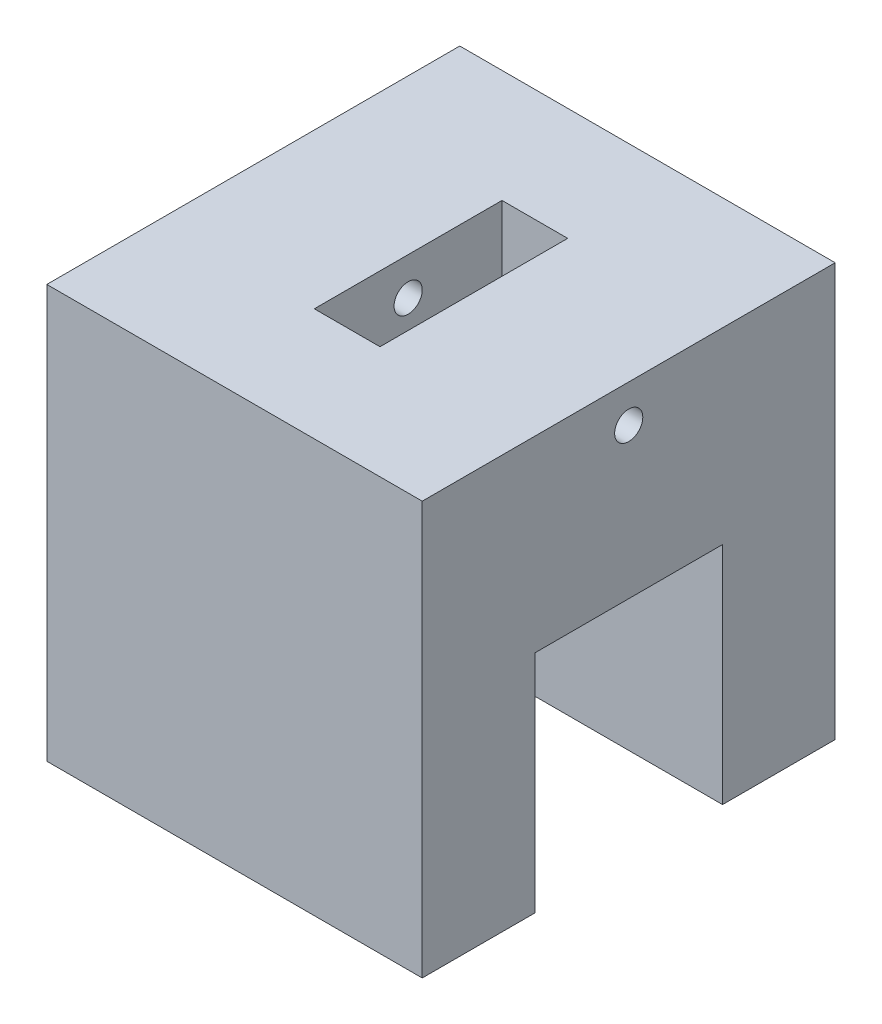
ISO-10303-21;
HEADER;
FILE_DESCRIPTION(('STEP AP214'),'2;1');
FILE_NAME('part.step','',(''),(''),'','','');
FILE_SCHEMA(('AUTOMOTIVE_DESIGN { 1 0 10303 214 1 1 1 1 }'));
ENDSEC;
DATA;
#1=APPLICATION_CONTEXT('core data for automotive mechanical design processes');
#2=APPLICATION_PROTOCOL_DEFINITION('international standard','automotive_design',2000,#1);
#3=PRODUCT_CONTEXT('',#1,'mechanical');
#4=PRODUCT('Part','Part','',(#3));
#5=PRODUCT_RELATED_PRODUCT_CATEGORY('part','',(#4));
#6=PRODUCT_DEFINITION_FORMATION('','',#4);
#7=PRODUCT_DEFINITION_CONTEXT('part definition',#1,'design');
#8=PRODUCT_DEFINITION('design','',#6,#7);
#9=PRODUCT_DEFINITION_SHAPE('','',#8);
#10=(LENGTH_UNIT() NAMED_UNIT(*) SI_UNIT(.MILLI.,.METRE.));
#11=(NAMED_UNIT(*) PLANE_ANGLE_UNIT() SI_UNIT($,.RADIAN.));
#12=(NAMED_UNIT(*) SI_UNIT($,.STERADIAN.) SOLID_ANGLE_UNIT());
#13=UNCERTAINTY_MEASURE_WITH_UNIT(LENGTH_MEASURE(1.E-05),#10,'distance_accuracy_value','');
#14=(GEOMETRIC_REPRESENTATION_CONTEXT(3) GLOBAL_UNCERTAINTY_ASSIGNED_CONTEXT((#13)) GLOBAL_UNIT_ASSIGNED_CONTEXT((#10,
#11,#12)) REPRESENTATION_CONTEXT('',''));
#15=CARTESIAN_POINT('',(0.,0.,0.));
#16=DIRECTION('',(0.,0.,1.));
#17=DIRECTION('',(1.,0.,0.));
#18=AXIS2_PLACEMENT_3D('',#15,#16,#17);
#19=CARTESIAN_POINT('',(-100.,80.,0.));
#20=DIRECTION('',(1.,0.,0.));
#21=DIRECTION('',(0.,0.,-1.));
#22=AXIS2_PLACEMENT_3D('',#19,#20,#21);
#23=CYLINDRICAL_SURFACE('',#22,7.50000000000001);
#24=CARTESIAN_POINT('',(-17.5,80.,0.));
#25=DIRECTION('',(-1.,0.,0.));
#26=DIRECTION('',(0.,0.,1.));
#27=AXIS2_PLACEMENT_3D('',#24,#25,#26);
#28=CIRCLE('',#27,7.50000000000001);
#29=CARTESIAN_POINT('',(-17.5,80.,7.49999999999998));
#30=VERTEX_POINT('',#29);
#31=EDGE_CURVE('E43',#30,#30,#28,.F.);
#32=ORIENTED_EDGE('',*,*,#31,.T.);
#33=EDGE_LOOP('',(#32));
#34=FACE_BOUND('',#33,.T.);
#35=CARTESIAN_POINT('',(-100.,80.,0.));
#36=DIRECTION('',(1.,0.,0.));
#37=DIRECTION('',(0.,0.,-1.));
#38=AXIS2_PLACEMENT_3D('',#35,#36,#37);
#39=CIRCLE('',#38,7.50000000000001);
#40=CARTESIAN_POINT('',(-100.,80.,-7.50000000000003));
#41=VERTEX_POINT('',#40);
#42=EDGE_CURVE('E222',#41,#41,#39,.T.);
#43=ORIENTED_EDGE('',*,*,#42,.F.);
#44=EDGE_LOOP('',(#43));
#45=FACE_BOUND('',#44,.T.);
#46=ADVANCED_FACE('F39',(#34,#45),#23,.F.);
#47=CARTESIAN_POINT('',(-100.,100.,110.));
#48=DIRECTION('',(0.,0.,1.));
#49=DIRECTION('',(0.,-1.,0.));
#50=AXIS2_PLACEMENT_3D('',#47,#48,#49);
#51=PLANE('',#50);
#52=DIRECTION('',(1.,0.,0.));
#53=VECTOR('',#52,1.);
#54=CARTESIAN_POINT('',(-100.,-120.,110.));
#55=LINE('',#54,#53);
#56=CARTESIAN_POINT('',(-100.,-120.,110.));
#57=VERTEX_POINT('',#56);
#58=CARTESIAN_POINT('',(100.,-120.,110.));
#59=VERTEX_POINT('',#58);
#60=EDGE_CURVE('E256',#57,#59,#55,.T.);
#61=ORIENTED_EDGE('',*,*,#60,.T.);
#62=DIRECTION('',(0.,-1.,0.));
#63=VECTOR('',#62,1.);
#64=CARTESIAN_POINT('',(100.,100.,110.));
#65=LINE('',#64,#63);
#66=CARTESIAN_POINT('',(100.,100.,110.));
#67=VERTEX_POINT('',#66);
#68=EDGE_CURVE('E190',#67,#59,#65,.T.);
#69=ORIENTED_EDGE('',*,*,#68,.F.);
#70=DIRECTION('',(1.,0.,0.));
#71=VECTOR('',#70,1.);
#72=CARTESIAN_POINT('',(-100.,100.,110.));
#73=LINE('',#72,#71);
#74=CARTESIAN_POINT('',(-100.,100.,110.));
#75=VERTEX_POINT('',#74);
#76=EDGE_CURVE('E11',#75,#67,#73,.T.);
#77=ORIENTED_EDGE('',*,*,#76,.F.);
#78=DIRECTION('',(0.,-1.,0.));
#79=VECTOR('',#78,1.);
#80=CARTESIAN_POINT('',(-100.,100.,110.));
#81=LINE('',#80,#79);
#82=EDGE_CURVE('E226',#75,#57,#81,.T.);
#83=ORIENTED_EDGE('',*,*,#82,.T.);
#84=EDGE_LOOP('',(#61,#69,#77,#83));
#85=FACE_BOUND('',#84,.T.);
#86=ADVANCED_FACE('F41',(#85),#51,.T.);
#87=CARTESIAN_POINT('',(-100.,100.,-110.));
#88=DIRECTION('',(0.,1.,0.));
#89=DIRECTION('',(0.,0.,1.));
#90=AXIS2_PLACEMENT_3D('',#87,#88,#89);
#91=PLANE('',#90);
#92=DIRECTION('',(0.,0.,1.));
#93=VECTOR('',#92,1.);
#94=CARTESIAN_POINT('',(-17.5,100.,-50.));
#95=LINE('',#94,#93);
#96=CARTESIAN_POINT('',(-17.5,100.,-50.));
#97=VERTEX_POINT('',#96);
#98=CARTESIAN_POINT('',(-17.5,100.,50.0000000000001));
#99=VERTEX_POINT('',#98);
#100=EDGE_CURVE('E57',#97,#99,#95,.T.);
#101=ORIENTED_EDGE('',*,*,#100,.F.);
#102=DIRECTION('',(-1.,0.,0.));
#103=VECTOR('',#102,1.);
#104=CARTESIAN_POINT('',(-17.5,100.,-50.));
#105=LINE('',#104,#103);
#106=CARTESIAN_POINT('',(17.5,100.,-50.));
#107=VERTEX_POINT('',#106);
#108=EDGE_CURVE('E154',#107,#97,#105,.T.);
#109=ORIENTED_EDGE('',*,*,#108,.F.);
#110=DIRECTION('',(0.,0.,-1.));
#111=VECTOR('',#110,1.);
#112=CARTESIAN_POINT('',(17.5,100.,-50.));
#113=LINE('',#112,#111);
#114=CARTESIAN_POINT('',(17.5,100.,50.));
#115=VERTEX_POINT('',#114);
#116=EDGE_CURVE('E158',#115,#107,#113,.T.);
#117=ORIENTED_EDGE('',*,*,#116,.F.);
#118=DIRECTION('',(1.,0.,0.));
#119=VECTOR('',#118,1.);
#120=CARTESIAN_POINT('',(-17.5,100.,50.0000000000001));
#121=LINE('',#120,#119);
#122=EDGE_CURVE('E170',#99,#115,#121,.T.);
#123=ORIENTED_EDGE('',*,*,#122,.F.);
#124=EDGE_LOOP('',(#101,#109,#117,#123));
#125=FACE_BOUND('',#124,.T.);
#126=ORIENTED_EDGE('',*,*,#76,.T.);
#127=DIRECTION('',(0.,0.,1.));
#128=VECTOR('',#127,1.);
#129=CARTESIAN_POINT('',(100.,100.,-110.));
#130=LINE('',#129,#128);
#131=CARTESIAN_POINT('',(100.,100.,-110.));
#132=VERTEX_POINT('',#131);
#133=EDGE_CURVE('E218',#132,#67,#130,.T.);
#134=ORIENTED_EDGE('',*,*,#133,.F.);
#135=DIRECTION('',(1.,0.,0.));
#136=VECTOR('',#135,1.);
#137=CARTESIAN_POINT('',(-100.,100.,-110.));
#138=LINE('',#137,#136);
#139=CARTESIAN_POINT('',(-100.,100.,-110.));
#140=VERTEX_POINT('',#139);
#141=EDGE_CURVE('E49',#140,#132,#138,.T.);
#142=ORIENTED_EDGE('',*,*,#141,.F.);
#143=DIRECTION('',(0.,0.,1.));
#144=VECTOR('',#143,1.);
#145=CARTESIAN_POINT('',(-100.,100.,-110.));
#146=LINE('',#145,#144);
#147=EDGE_CURVE('E253',#140,#75,#146,.T.);
#148=ORIENTED_EDGE('',*,*,#147,.T.);
#149=EDGE_LOOP('',(#126,#134,#142,#148));
#150=FACE_BOUND('',#149,.T.);
#151=ADVANCED_FACE('F305',(#125,#150),#91,.T.);
#152=CARTESIAN_POINT('',(-100.,-120.,-110.));
#153=DIRECTION('',(0.,0.,-1.));
#154=DIRECTION('',(-1.,0.,0.));
#155=AXIS2_PLACEMENT_3D('',#152,#153,#154);
#156=PLANE('',#155);
#157=ORIENTED_EDGE('',*,*,#141,.T.);
#158=DIRECTION('',(0.,1.,0.));
#159=VECTOR('',#158,1.);
#160=CARTESIAN_POINT('',(100.,-120.,-110.));
#161=LINE('',#160,#159);
#162=CARTESIAN_POINT('',(100.,-120.,-110.));
#163=VERTEX_POINT('',#162);
#164=EDGE_CURVE('E214',#163,#132,#161,.T.);
#165=ORIENTED_EDGE('',*,*,#164,.F.);
#166=DIRECTION('',(1.,0.,0.));
#167=VECTOR('',#166,1.);
#168=CARTESIAN_POINT('',(-100.,-120.,-110.));
#169=LINE('',#168,#167);
#170=CARTESIAN_POINT('',(-100.,-120.,-110.));
#171=VERTEX_POINT('',#170);
#172=EDGE_CURVE('E260',#171,#163,#169,.T.);
#173=ORIENTED_EDGE('',*,*,#172,.F.);
#174=DIRECTION('',(0.,1.,0.));
#175=VECTOR('',#174,1.);
#176=CARTESIAN_POINT('',(-100.,-120.,-110.));
#177=LINE('',#176,#175);
#178=EDGE_CURVE('E249',#171,#140,#177,.T.);
#179=ORIENTED_EDGE('',*,*,#178,.T.);
#180=EDGE_LOOP('',(#157,#165,#173,#179));
#181=FACE_BOUND('',#180,.T.);
#182=ADVANCED_FACE('F326',(#181),#156,.T.);
#183=CARTESIAN_POINT('',(-100.,-120.,-50.));
#184=DIRECTION('',(0.,-1.,0.));
#185=DIRECTION('',(0.,0.,-1.));
#186=AXIS2_PLACEMENT_3D('',#183,#184,#185);
#187=PLANE('',#186);
#188=ORIENTED_EDGE('',*,*,#172,.T.);
#189=DIRECTION('',(0.,0.,-1.));
#190=VECTOR('',#189,1.);
#191=CARTESIAN_POINT('',(100.,-120.,-50.));
#192=LINE('',#191,#190);
#193=CARTESIAN_POINT('',(100.,-120.,-50.));
#194=VERTEX_POINT('',#193);
#195=EDGE_CURVE('E210',#194,#163,#192,.T.);
#196=ORIENTED_EDGE('',*,*,#195,.F.);
#197=DIRECTION('',(1.,0.,0.));
#198=VECTOR('',#197,1.);
#199=CARTESIAN_POINT('',(-100.,-120.,-50.));
#200=LINE('',#199,#198);
#201=CARTESIAN_POINT('',(-100.,-120.,-50.));
#202=VERTEX_POINT('',#201);
#203=EDGE_CURVE('E263',#202,#194,#200,.T.);
#204=ORIENTED_EDGE('',*,*,#203,.F.);
#205=DIRECTION('',(0.,0.,-1.));
#206=VECTOR('',#205,1.);
#207=CARTESIAN_POINT('',(-100.,-120.,-50.));
#208=LINE('',#207,#206);
#209=EDGE_CURVE('E245',#202,#171,#208,.T.);
#210=ORIENTED_EDGE('',*,*,#209,.T.);
#211=EDGE_LOOP('',(#188,#196,#204,#210));
#212=FACE_BOUND('',#211,.T.);
#213=ADVANCED_FACE('F330',(#212),#187,.T.);
#214=CARTESIAN_POINT('',(-100.,0.,-50.));
#215=DIRECTION('',(0.,0.,1.));
#216=DIRECTION('',(0.,-1.,0.));
#217=AXIS2_PLACEMENT_3D('',#214,#215,#216);
#218=PLANE('',#217);
#219=ORIENTED_EDGE('',*,*,#203,.T.);
#220=DIRECTION('',(0.,-1.,0.));
#221=VECTOR('',#220,1.);
#222=CARTESIAN_POINT('',(100.,0.,-50.));
#223=LINE('',#222,#221);
#224=CARTESIAN_POINT('',(100.,0.,-50.));
#225=VERTEX_POINT('',#224);
#226=EDGE_CURVE('E206',#225,#194,#223,.T.);
#227=ORIENTED_EDGE('',*,*,#226,.F.);
#228=DIRECTION('',(1.,0.,0.));
#229=VECTOR('',#228,1.);
#230=CARTESIAN_POINT('',(-100.,0.,-50.));
#231=LINE('',#230,#229);
#232=CARTESIAN_POINT('',(-100.,0.,-50.));
#233=VERTEX_POINT('',#232);
#234=EDGE_CURVE('E266',#233,#225,#231,.T.);
#235=ORIENTED_EDGE('',*,*,#234,.F.);
#236=DIRECTION('',(0.,-1.,0.));
#237=VECTOR('',#236,1.);
#238=CARTESIAN_POINT('',(-100.,0.,-50.));
#239=LINE('',#238,#237);
#240=EDGE_CURVE('E241',#233,#202,#239,.T.);
#241=ORIENTED_EDGE('',*,*,#240,.T.);
#242=EDGE_LOOP('',(#219,#227,#235,#241));
#243=FACE_BOUND('',#242,.T.);
#244=ADVANCED_FACE('F334',(#243),#218,.T.);
#245=CARTESIAN_POINT('',(-100.,0.,50.));
#246=DIRECTION('',(0.,-1.,0.));
#247=DIRECTION('',(0.,0.,-1.));
#248=AXIS2_PLACEMENT_3D('',#245,#246,#247);
#249=PLANE('',#248);
#250=CARTESIAN_POINT('',(-70.,0.,0.));
#251=DIRECTION('',(0.,-1.,0.));
#252=DIRECTION('',(0.,0.,-1.));
#253=AXIS2_PLACEMENT_3D('',#250,#251,#252);
#254=CIRCLE('',#253,7.50000000000001);
#255=CARTESIAN_POINT('',(-70.,0.,-7.50000000000001));
#256=VERTEX_POINT('',#255);
#257=EDGE_CURVE('E482',#256,#256,#254,.T.);
#258=ORIENTED_EDGE('',*,*,#257,.F.);
#259=EDGE_LOOP('',(#258));
#260=FACE_BOUND('',#259,.T.);
#261=CARTESIAN_POINT('',(70.,0.,0.));
#262=DIRECTION('',(0.,-1.,0.));
#263=DIRECTION('',(0.,0.,-1.));
#264=AXIS2_PLACEMENT_3D('',#261,#262,#263);
#265=CIRCLE('',#264,7.50000000000001);
#266=CARTESIAN_POINT('',(70.,0.,-7.49999999999999));
#267=VERTEX_POINT('',#266);
#268=EDGE_CURVE('E161',#267,#267,#265,.T.);
#269=ORIENTED_EDGE('',*,*,#268,.F.);
#270=EDGE_LOOP('',(#269));
#271=FACE_BOUND('',#270,.T.);
#272=ORIENTED_EDGE('',*,*,#234,.T.);
#273=DIRECTION('',(0.,0.,-1.));
#274=VECTOR('',#273,1.);
#275=CARTESIAN_POINT('',(100.,0.,50.));
#276=LINE('',#275,#274);
#277=CARTESIAN_POINT('',(100.,0.,50.));
#278=VERTEX_POINT('',#277);
#279=EDGE_CURVE('E202',#278,#225,#276,.T.);
#280=ORIENTED_EDGE('',*,*,#279,.F.);
#281=DIRECTION('',(1.,0.,0.));
#282=VECTOR('',#281,1.);
#283=CARTESIAN_POINT('',(-100.,0.,50.));
#284=LINE('',#283,#282);
#285=CARTESIAN_POINT('',(-100.,0.,50.));
#286=VERTEX_POINT('',#285);
#287=EDGE_CURVE('E269',#286,#278,#284,.T.);
#288=ORIENTED_EDGE('',*,*,#287,.F.);
#289=DIRECTION('',(0.,0.,-1.));
#290=VECTOR('',#289,1.);
#291=CARTESIAN_POINT('',(-100.,0.,50.));
#292=LINE('',#291,#290);
#293=EDGE_CURVE('E237',#286,#233,#292,.T.);
#294=ORIENTED_EDGE('',*,*,#293,.T.);
#295=EDGE_LOOP('',(#272,#280,#288,#294));
#296=FACE_BOUND('',#295,.T.);
#297=ADVANCED_FACE('F338',(#260,#271,#296),#249,.T.);
#298=CARTESIAN_POINT('',(-100.,-120.,50.));
#299=DIRECTION('',(0.,0.,-1.));
#300=DIRECTION('',(0.,1.,0.));
#301=AXIS2_PLACEMENT_3D('',#298,#299,#300);
#302=PLANE('',#301);
#303=ORIENTED_EDGE('',*,*,#287,.T.);
#304=DIRECTION('',(0.,1.,0.));
#305=VECTOR('',#304,1.);
#306=CARTESIAN_POINT('',(100.,-120.,50.));
#307=LINE('',#306,#305);
#308=CARTESIAN_POINT('',(100.,-120.,50.));
#309=VERTEX_POINT('',#308);
#310=EDGE_CURVE('E198',#309,#278,#307,.T.);
#311=ORIENTED_EDGE('',*,*,#310,.F.);
#312=DIRECTION('',(1.,0.,0.));
#313=VECTOR('',#312,1.);
#314=CARTESIAN_POINT('',(-100.,-120.,50.));
#315=LINE('',#314,#313);
#316=CARTESIAN_POINT('',(-100.,-120.,50.));
#317=VERTEX_POINT('',#316);
#318=EDGE_CURVE('E272',#317,#309,#315,.T.);
#319=ORIENTED_EDGE('',*,*,#318,.F.);
#320=DIRECTION('',(0.,1.,0.));
#321=VECTOR('',#320,1.);
#322=CARTESIAN_POINT('',(-100.,-120.,50.));
#323=LINE('',#322,#321);
#324=EDGE_CURVE('E233',#317,#286,#323,.T.);
#325=ORIENTED_EDGE('',*,*,#324,.T.);
#326=EDGE_LOOP('',(#303,#311,#319,#325));
#327=FACE_BOUND('',#326,.T.);
#328=ADVANCED_FACE('F320',(#327),#302,.T.);
#329=CARTESIAN_POINT('',(-100.,-120.,110.));
#330=DIRECTION('',(0.,-1.,0.));
#331=DIRECTION('',(0.,0.,-1.));
#332=AXIS2_PLACEMENT_3D('',#329,#330,#331);
#333=PLANE('',#332);
#334=ORIENTED_EDGE('',*,*,#318,.T.);
#335=DIRECTION('',(0.,0.,-1.));
#336=VECTOR('',#335,1.);
#337=CARTESIAN_POINT('',(100.,-120.,110.));
#338=LINE('',#337,#336);
#339=EDGE_CURVE('E194',#59,#309,#338,.T.);
#340=ORIENTED_EDGE('',*,*,#339,.F.);
#341=ORIENTED_EDGE('',*,*,#60,.F.);
#342=DIRECTION('',(0.,0.,-1.));
#343=VECTOR('',#342,1.);
#344=CARTESIAN_POINT('',(-100.,-120.,110.));
#345=LINE('',#344,#343);
#346=EDGE_CURVE('E229',#57,#317,#345,.T.);
#347=ORIENTED_EDGE('',*,*,#346,.T.);
#348=EDGE_LOOP('',(#334,#340,#341,#347));
#349=FACE_BOUND('',#348,.T.);
#350=ADVANCED_FACE('F312',(#349),#333,.T.);
#351=CARTESIAN_POINT('',(-100.,0.,0.));
#352=DIRECTION('',(1.,0.,0.));
#353=DIRECTION('',(0.,0.,-1.));
#354=AXIS2_PLACEMENT_3D('',#351,#352,#353);
#355=PLANE('',#354);
#356=ORIENTED_EDGE('',*,*,#42,.T.);
#357=EDGE_LOOP('',(#356));
#358=FACE_BOUND('',#357,.T.);
#359=ORIENTED_EDGE('',*,*,#82,.F.);
#360=ORIENTED_EDGE('',*,*,#147,.F.);
#361=ORIENTED_EDGE('',*,*,#178,.F.);
#362=ORIENTED_EDGE('',*,*,#209,.F.);
#363=ORIENTED_EDGE('',*,*,#240,.F.);
#364=ORIENTED_EDGE('',*,*,#293,.F.);
#365=ORIENTED_EDGE('',*,*,#324,.F.);
#366=ORIENTED_EDGE('',*,*,#346,.F.);
#367=EDGE_LOOP('',(#359,#360,#361,#362,#363,#364,#365,#366));
#368=FACE_BOUND('',#367,.T.);
#369=ADVANCED_FACE('F308',(#358,#368),#355,.F.);
#370=CARTESIAN_POINT('',(17.5,80.,0.));
#371=DIRECTION('',(1.,0.,0.));
#372=DIRECTION('',(0.,0.,-1.));
#373=AXIS2_PLACEMENT_3D('',#370,#371,#372);
#374=CIRCLE('',#373,7.50000000000001);
#375=CARTESIAN_POINT('',(17.5,80.,-7.50000000000003));
#376=VERTEX_POINT('',#375);
#377=EDGE_CURVE('E180',#376,#376,#374,.F.);
#378=ORIENTED_EDGE('',*,*,#377,.T.);
#379=EDGE_LOOP('',(#378));
#380=FACE_BOUND('',#379,.T.);
#381=CARTESIAN_POINT('',(100.,80.,0.));
#382=DIRECTION('',(1.,0.,0.));
#383=DIRECTION('',(0.,0.,-1.));
#384=AXIS2_PLACEMENT_3D('',#381,#382,#383);
#385=CIRCLE('',#384,7.50000000000001);
#386=CARTESIAN_POINT('',(100.,80.,-7.50000000000003));
#387=VERTEX_POINT('',#386);
#388=EDGE_CURVE('E186',#387,#387,#385,.T.);
#389=ORIENTED_EDGE('',*,*,#388,.T.);
#390=EDGE_LOOP('',(#389));
#391=FACE_BOUND('',#390,.T.);
#392=ADVANCED_FACE('F296',(#380,#391),#23,.F.);
#393=CARTESIAN_POINT('',(100.,0.,0.));
#394=DIRECTION('',(1.,0.,0.));
#395=DIRECTION('',(0.,0.,-1.));
#396=AXIS2_PLACEMENT_3D('',#393,#394,#395);
#397=PLANE('',#396);
#398=ORIENTED_EDGE('',*,*,#68,.T.);
#399=ORIENTED_EDGE('',*,*,#339,.T.);
#400=ORIENTED_EDGE('',*,*,#310,.T.);
#401=ORIENTED_EDGE('',*,*,#279,.T.);
#402=ORIENTED_EDGE('',*,*,#226,.T.);
#403=ORIENTED_EDGE('',*,*,#195,.T.);
#404=ORIENTED_EDGE('',*,*,#164,.T.);
#405=ORIENTED_EDGE('',*,*,#133,.T.);
#406=EDGE_LOOP('',(#398,#399,#400,#401,#402,#403,#404,#405));
#407=FACE_BOUND('',#406,.T.);
#408=ORIENTED_EDGE('',*,*,#388,.F.);
#409=EDGE_LOOP('',(#408));
#410=FACE_BOUND('',#409,.T.);
#411=ADVANCED_FACE('F287',(#407,#410),#397,.T.);
#412=CARTESIAN_POINT('',(-17.5,40.0000000000001,-50.));
#413=DIRECTION('',(-1.,0.,0.));
#414=DIRECTION('',(0.,0.,1.));
#415=AXIS2_PLACEMENT_3D('',#412,#413,#414);
#416=PLANE('',#415);
#417=ORIENTED_EDGE('',*,*,#100,.T.);
#418=DIRECTION('',(0.,1.,0.));
#419=VECTOR('',#418,1.);
#420=CARTESIAN_POINT('',(-17.5,40.0000000000001,50.0000000000001));
#421=LINE('',#420,#419);
#422=CARTESIAN_POINT('',(-17.5,40.0000000000001,50.0000000000001));
#423=VERTEX_POINT('',#422);
#424=EDGE_CURVE('E128',#423,#99,#421,.T.);
#425=ORIENTED_EDGE('',*,*,#424,.F.);
#426=DIRECTION('',(0.,0.,1.));
#427=VECTOR('',#426,1.);
#428=CARTESIAN_POINT('',(-17.5,40.0000000000001,-50.));
#429=LINE('',#428,#427);
#430=CARTESIAN_POINT('',(-17.5,40.0000000000001,-50.));
#431=VERTEX_POINT('',#430);
#432=EDGE_CURVE('E133',#431,#423,#429,.T.);
#433=ORIENTED_EDGE('',*,*,#432,.F.);
#434=DIRECTION('',(0.,1.,0.));
#435=VECTOR('',#434,1.);
#436=CARTESIAN_POINT('',(-17.5,40.0000000000001,-50.));
#437=LINE('',#436,#435);
#438=EDGE_CURVE('E177',#431,#97,#437,.T.);
#439=ORIENTED_EDGE('',*,*,#438,.T.);
#440=EDGE_LOOP('',(#417,#425,#433,#439));
#441=FACE_BOUND('',#440,.T.);
#442=ORIENTED_EDGE('',*,*,#31,.F.);
#443=EDGE_LOOP('',(#442));
#444=FACE_BOUND('',#443,.T.);
#445=ADVANCED_FACE('F130',(#441,#444),#416,.F.);
#446=CARTESIAN_POINT('',(17.5,40.0000000000001,-50.));
#447=DIRECTION('',(1.,0.,0.));
#448=DIRECTION('',(0.,0.,-1.));
#449=AXIS2_PLACEMENT_3D('',#446,#447,#448);
#450=PLANE('',#449);
#451=ORIENTED_EDGE('',*,*,#116,.T.);
#452=DIRECTION('',(0.,1.,0.));
#453=VECTOR('',#452,1.);
#454=CARTESIAN_POINT('',(17.5,40.0000000000001,-50.));
#455=LINE('',#454,#453);
#456=CARTESIAN_POINT('',(17.5,40.0000000000001,-50.));
#457=VERTEX_POINT('',#456);
#458=EDGE_CURVE('E181',#457,#107,#455,.T.);
#459=ORIENTED_EDGE('',*,*,#458,.F.);
#460=DIRECTION('',(0.,0.,-1.));
#461=VECTOR('',#460,1.);
#462=CARTESIAN_POINT('',(17.5,40.0000000000001,-50.));
#463=LINE('',#462,#461);
#464=CARTESIAN_POINT('',(17.5,40.0000000000001,50.));
#465=VERTEX_POINT('',#464);
#466=EDGE_CURVE('E149',#465,#457,#463,.T.);
#467=ORIENTED_EDGE('',*,*,#466,.F.);
#468=DIRECTION('',(0.,1.,0.));
#469=VECTOR('',#468,1.);
#470=CARTESIAN_POINT('',(17.5,40.0000000000001,50.));
#471=LINE('',#470,#469);
#472=EDGE_CURVE('E139',#465,#115,#471,.T.);
#473=ORIENTED_EDGE('',*,*,#472,.T.);
#474=EDGE_LOOP('',(#451,#459,#467,#473));
#475=FACE_BOUND('',#474,.T.);
#476=ORIENTED_EDGE('',*,*,#377,.F.);
#477=EDGE_LOOP('',(#476));
#478=FACE_BOUND('',#477,.T.);
#479=ADVANCED_FACE('F286',(#475,#478),#450,.F.);
#480=CARTESIAN_POINT('',(-17.5,40.0000000000001,-50.));
#481=DIRECTION('',(0.,0.,-1.));
#482=DIRECTION('',(-1.,0.,0.));
#483=AXIS2_PLACEMENT_3D('',#480,#481,#482);
#484=PLANE('',#483);
#485=ORIENTED_EDGE('',*,*,#108,.T.);
#486=ORIENTED_EDGE('',*,*,#438,.F.);
#487=DIRECTION('',(-1.,0.,0.));
#488=VECTOR('',#487,1.);
#489=CARTESIAN_POINT('',(-17.5,40.0000000000001,-50.));
#490=LINE('',#489,#488);
#491=EDGE_CURVE('E140',#457,#431,#490,.T.);
#492=ORIENTED_EDGE('',*,*,#491,.F.);
#493=ORIENTED_EDGE('',*,*,#458,.T.);
#494=EDGE_LOOP('',(#485,#486,#492,#493));
#495=FACE_BOUND('',#494,.T.);
#496=ADVANCED_FACE('F293',(#495),#484,.F.);
#497=CARTESIAN_POINT('',(-17.5,40.0000000000001,50.0000000000001));
#498=DIRECTION('',(0.,0.,1.));
#499=DIRECTION('',(1.,0.,0.));
#500=AXIS2_PLACEMENT_3D('',#497,#498,#499);
#501=PLANE('',#500);
#502=ORIENTED_EDGE('',*,*,#122,.T.);
#503=ORIENTED_EDGE('',*,*,#472,.F.);
#504=DIRECTION('',(1.,0.,0.));
#505=VECTOR('',#504,1.);
#506=CARTESIAN_POINT('',(-17.5,40.0000000000001,50.0000000000001));
#507=LINE('',#506,#505);
#508=EDGE_CURVE('E143',#423,#465,#507,.T.);
#509=ORIENTED_EDGE('',*,*,#508,.F.);
#510=ORIENTED_EDGE('',*,*,#424,.T.);
#511=EDGE_LOOP('',(#502,#503,#509,#510));
#512=FACE_BOUND('',#511,.T.);
#513=ADVANCED_FACE('F144',(#512),#501,.F.);
#514=CARTESIAN_POINT('',(0.,40.0000000000001,0.));
#515=DIRECTION('',(0.,1.,0.));
#516=DIRECTION('',(0.,0.,1.));
#517=AXIS2_PLACEMENT_3D('',#514,#515,#516);
#518=PLANE('',#517);
#519=ORIENTED_EDGE('',*,*,#432,.T.);
#520=ORIENTED_EDGE('',*,*,#508,.T.);
#521=ORIENTED_EDGE('',*,*,#466,.T.);
#522=ORIENTED_EDGE('',*,*,#491,.T.);
#523=EDGE_LOOP('',(#519,#520,#521,#522));
#524=FACE_BOUND('',#523,.T.);
#525=ADVANCED_FACE('F151',(#524),#518,.T.);
#526=CARTESIAN_POINT('',(70.,60.,0.));
#527=DIRECTION('',(0.,-1.,0.));
#528=DIRECTION('',(0.,0.,-1.));
#529=AXIS2_PLACEMENT_3D('',#526,#527,#528);
#530=CYLINDRICAL_SURFACE('',#529,7.50000000000001);
#531=CARTESIAN_POINT('',(70.,60.,0.));
#532=DIRECTION('',(0.,-1.,0.));
#533=DIRECTION('',(0.,0.,-1.));
#534=AXIS2_PLACEMENT_3D('',#531,#532,#533);
#535=CIRCLE('',#534,7.50000000000001);
#536=CARTESIAN_POINT('',(70.,60.,-7.49999999999999));
#537=VERTEX_POINT('',#536);
#538=EDGE_CURVE('E486',#537,#537,#535,.T.);
#539=ORIENTED_EDGE('',*,*,#538,.F.);
#540=EDGE_LOOP('',(#539));
#541=FACE_BOUND('',#540,.T.);
#542=ORIENTED_EDGE('',*,*,#268,.T.);
#543=EDGE_LOOP('',(#542));
#544=FACE_BOUND('',#543,.T.);
#545=ADVANCED_FACE('F430',(#541,#544),#530,.F.);
#546=CARTESIAN_POINT('',(70.,60.,0.));
#547=DIRECTION('',(0.,-1.,0.));
#548=DIRECTION('',(0.,0.,-1.));
#549=AXIS2_PLACEMENT_3D('',#546,#547,#548);
#550=PLANE('',#549);
#551=ORIENTED_EDGE('',*,*,#538,.T.);
#552=EDGE_LOOP('',(#551));
#553=FACE_BOUND('',#552,.T.);
#554=ADVANCED_FACE('F445',(#553),#550,.T.);
#555=CARTESIAN_POINT('',(-70.,60.,0.));
#556=DIRECTION('',(0.,-1.,0.));
#557=DIRECTION('',(0.,0.,-1.));
#558=AXIS2_PLACEMENT_3D('',#555,#556,#557);
#559=CYLINDRICAL_SURFACE('',#558,7.50000000000001);
#560=CARTESIAN_POINT('',(-70.,60.,0.));
#561=DIRECTION('',(0.,-1.,0.));
#562=DIRECTION('',(0.,0.,-1.));
#563=AXIS2_PLACEMENT_3D('',#560,#561,#562);
#564=CIRCLE('',#563,7.50000000000001);
#565=CARTESIAN_POINT('',(-70.,60.,-7.50000000000001));
#566=VERTEX_POINT('',#565);
#567=EDGE_CURVE('E171',#566,#566,#564,.T.);
#568=ORIENTED_EDGE('',*,*,#567,.F.);
#569=EDGE_LOOP('',(#568));
#570=FACE_BOUND('',#569,.T.);
#571=ORIENTED_EDGE('',*,*,#257,.T.);
#572=EDGE_LOOP('',(#571));
#573=FACE_BOUND('',#572,.T.);
#574=ADVANCED_FACE('F455',(#570,#573),#559,.F.);
#575=CARTESIAN_POINT('',(-70.,60.,0.));
#576=DIRECTION('',(0.,-1.,0.));
#577=DIRECTION('',(0.,0.,-1.));
#578=AXIS2_PLACEMENT_3D('',#575,#576,#577);
#579=PLANE('',#578);
#580=ORIENTED_EDGE('',*,*,#567,.T.);
#581=EDGE_LOOP('',(#580));
#582=FACE_BOUND('',#581,.T.);
#583=ADVANCED_FACE('F465',(#582),#579,.T.);
#584=CLOSED_SHELL('',(#46,#86,#151,#182,#213,#244,#297,#328,#350,#369,#392,#411,#445,#479,#496,
#513,#525,#545,#554,#574,#583));
#585=MANIFOLD_SOLID_BREP('B2',#584);
#586=ADVANCED_BREP_SHAPE_REPRESENTATION('',(#18,#585),#14);
#587=SHAPE_DEFINITION_REPRESENTATION(#9,#586);
ENDSEC;
END-ISO-10303-21;
